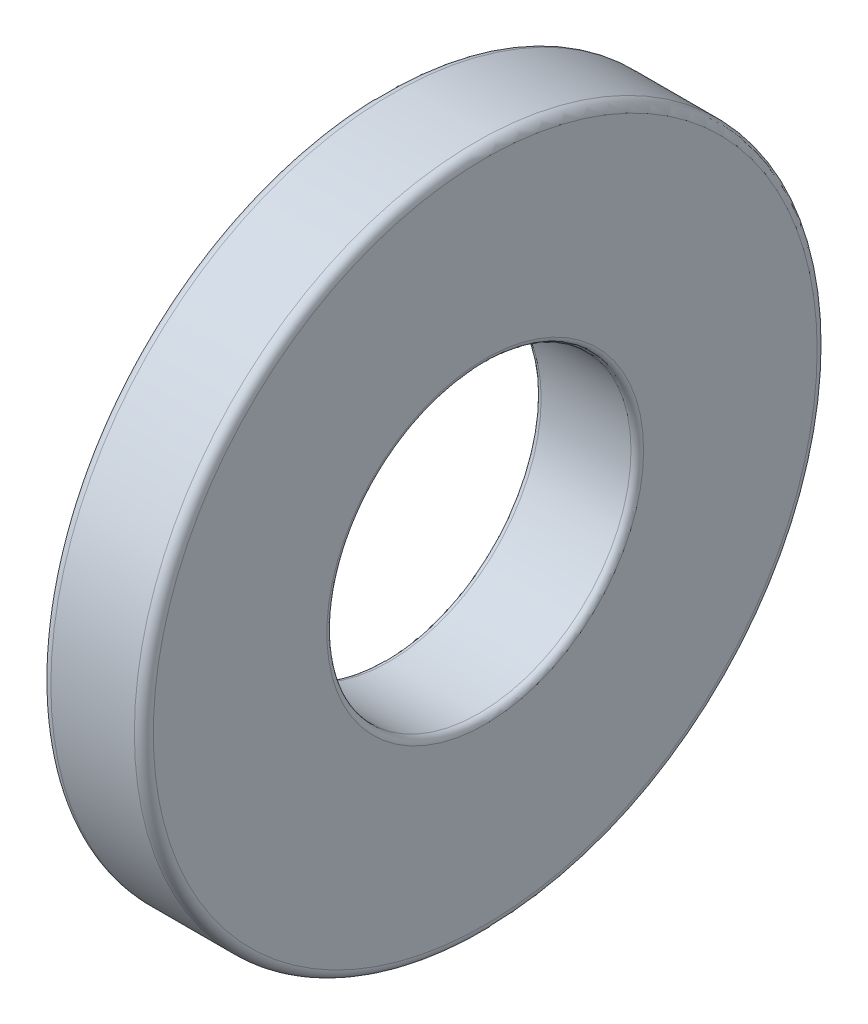
ISO-10303-21;
HEADER;
FILE_DESCRIPTION(('STEP AP214'),'2;1');
FILE_NAME('part.step','',(''),(''),'','','');
FILE_SCHEMA(('AUTOMOTIVE_DESIGN { 1 0 10303 214 1 1 1 1 }'));
ENDSEC;
DATA;
#1=APPLICATION_CONTEXT('core data for automotive mechanical design processes');
#2=APPLICATION_PROTOCOL_DEFINITION('international standard','automotive_design',2000,#1);
#3=PRODUCT_CONTEXT('',#1,'mechanical');
#4=PRODUCT('Part','Part','',(#3));
#5=PRODUCT_RELATED_PRODUCT_CATEGORY('part','',(#4));
#6=PRODUCT_DEFINITION_FORMATION('','',#4);
#7=PRODUCT_DEFINITION_CONTEXT('part definition',#1,'design');
#8=PRODUCT_DEFINITION('design','',#6,#7);
#9=PRODUCT_DEFINITION_SHAPE('','',#8);
#10=(LENGTH_UNIT() NAMED_UNIT(*) SI_UNIT(.MILLI.,.METRE.));
#11=(NAMED_UNIT(*) PLANE_ANGLE_UNIT() SI_UNIT($,.RADIAN.));
#12=(NAMED_UNIT(*) SI_UNIT($,.STERADIAN.) SOLID_ANGLE_UNIT());
#13=UNCERTAINTY_MEASURE_WITH_UNIT(LENGTH_MEASURE(1.E-05),#10,'distance_accuracy_value','');
#14=(GEOMETRIC_REPRESENTATION_CONTEXT(3) GLOBAL_UNCERTAINTY_ASSIGNED_CONTEXT((#13)) GLOBAL_UNIT_ASSIGNED_CONTEXT((#10,
#11,#12)) REPRESENTATION_CONTEXT('',''));
#15=CARTESIAN_POINT('',(0.,0.,0.));
#16=DIRECTION('',(0.,0.,1.));
#17=DIRECTION('',(1.,0.,0.));
#18=AXIS2_PLACEMENT_3D('',#15,#16,#17);
#19=CARTESIAN_POINT('',(1.65,0.,0.));
#20=DIRECTION('',(1.,0.,0.));
#21=DIRECTION('',(0.,0.,-1.));
#22=AXIS2_PLACEMENT_3D('',#19,#20,#21);
#23=PLANE('',#22);
#24=CARTESIAN_POINT('',(1.65,0.,0.));
#25=DIRECTION('',(1.,0.,0.));
#26=DIRECTION('',(0.,0.,-1.));
#27=AXIS2_PLACEMENT_3D('',#24,#25,#26);
#28=CIRCLE('',#27,2.5516);
#29=CARTESIAN_POINT('',(1.65,0.,-2.5516));
#30=VERTEX_POINT('',#29);
#31=EDGE_CURVE('E10',#30,#30,#28,.F.);
#32=ORIENTED_EDGE('',*,*,#31,.T.);
#33=EDGE_LOOP('',(#32));
#34=FACE_BOUND('',#33,.T.);
#35=CARTESIAN_POINT('',(1.65,0.,0.));
#36=DIRECTION('',(1.,0.,0.));
#37=DIRECTION('',(0.,0.,-1.));
#38=AXIS2_PLACEMENT_3D('',#35,#36,#37);
#39=CIRCLE('',#38,5.3476);
#40=CARTESIAN_POINT('',(1.65,0.,-5.3476));
#41=VERTEX_POINT('',#40);
#42=EDGE_CURVE('E51',#41,#41,#39,.T.);
#43=ORIENTED_EDGE('',*,*,#42,.T.);
#44=EDGE_LOOP('',(#43));
#45=FACE_BOUND('',#44,.T.);
#46=ADVANCED_FACE('F31',(#34,#45),#23,.T.);
#47=CARTESIAN_POINT('',(0.,0.,0.));
#48=DIRECTION('',(1.,0.,0.));
#49=DIRECTION('',(0.,0.,-1.));
#50=AXIS2_PLACEMENT_3D('',#47,#48,#49);
#51=PLANE('',#50);
#52=CARTESIAN_POINT('',(0.,0.,0.));
#53=DIRECTION('',(1.,0.,0.));
#54=DIRECTION('',(0.,0.,-1.));
#55=AXIS2_PLACEMENT_3D('',#52,#53,#54);
#56=CIRCLE('',#55,2.5516);
#57=CARTESIAN_POINT('',(0.,0.,-2.5516));
#58=VERTEX_POINT('',#57);
#59=EDGE_CURVE('E46',#58,#58,#56,.T.);
#60=ORIENTED_EDGE('',*,*,#59,.T.);
#61=EDGE_LOOP('',(#60));
#62=FACE_BOUND('',#61,.T.);
#63=CARTESIAN_POINT('',(0.,0.,0.));
#64=DIRECTION('',(1.,0.,0.));
#65=DIRECTION('',(0.,0.,-1.));
#66=AXIS2_PLACEMENT_3D('',#63,#64,#65);
#67=CIRCLE('',#66,5.3476);
#68=CARTESIAN_POINT('',(0.,0.,-5.3476));
#69=VERTEX_POINT('',#68);
#70=EDGE_CURVE('E54',#69,#69,#67,.F.);
#71=ORIENTED_EDGE('',*,*,#70,.T.);
#72=EDGE_LOOP('',(#71));
#73=FACE_BOUND('',#72,.T.);
#74=ADVANCED_FACE('F75',(#62,#73),#51,.F.);
#75=CARTESIAN_POINT('',(1.65,0.,0.));
#76=DIRECTION('',(-1.,0.,0.));
#77=DIRECTION('',(0.,0.,1.));
#78=AXIS2_PLACEMENT_3D('',#75,#76,#77);
#79=CYLINDRICAL_SURFACE('',#78,5.5);
#80=CARTESIAN_POINT('',(0.1524,0.,0.));
#81=DIRECTION('',(1.,0.,0.));
#82=DIRECTION('',(0.,0.,-1.));
#83=AXIS2_PLACEMENT_3D('',#80,#81,#82);
#84=CIRCLE('',#83,5.5);
#85=CARTESIAN_POINT('',(0.1524,0.,-5.5));
#86=VERTEX_POINT('',#85);
#87=EDGE_CURVE('E57',#86,#86,#84,.T.);
#88=ORIENTED_EDGE('',*,*,#87,.T.);
#89=EDGE_LOOP('',(#88));
#90=FACE_BOUND('',#89,.T.);
#91=CARTESIAN_POINT('',(1.4976,0.,0.));
#92=DIRECTION('',(1.,0.,0.));
#93=DIRECTION('',(0.,0.,-1.));
#94=AXIS2_PLACEMENT_3D('',#91,#92,#93);
#95=CIRCLE('',#94,5.5);
#96=CARTESIAN_POINT('',(1.4976,0.,-5.5));
#97=VERTEX_POINT('',#96);
#98=EDGE_CURVE('E60',#97,#97,#95,.F.);
#99=ORIENTED_EDGE('',*,*,#98,.T.);
#100=EDGE_LOOP('',(#99));
#101=FACE_BOUND('',#100,.T.);
#102=ADVANCED_FACE('F64',(#90,#101),#79,.T.);
#103=CARTESIAN_POINT('',(1.65,0.,0.));
#104=DIRECTION('',(-1.,0.,0.));
#105=DIRECTION('',(0.,0.,1.));
#106=AXIS2_PLACEMENT_3D('',#103,#104,#105);
#107=CYLINDRICAL_SURFACE('',#106,2.45);
#108=CARTESIAN_POINT('',(0.1016,0.,0.));
#109=DIRECTION('',(1.,0.,0.));
#110=DIRECTION('',(0.,0.,-1.));
#111=AXIS2_PLACEMENT_3D('',#108,#109,#110);
#112=CIRCLE('',#111,2.45);
#113=CARTESIAN_POINT('',(0.1016,0.,-2.45));
#114=VERTEX_POINT('',#113);
#115=EDGE_CURVE('E38',#114,#114,#112,.F.);
#116=ORIENTED_EDGE('',*,*,#115,.T.);
#117=EDGE_LOOP('',(#116));
#118=FACE_BOUND('',#117,.T.);
#119=CARTESIAN_POINT('',(1.5484,0.,0.));
#120=DIRECTION('',(1.,0.,0.));
#121=DIRECTION('',(0.,0.,-1.));
#122=AXIS2_PLACEMENT_3D('',#119,#120,#121);
#123=CIRCLE('',#122,2.45);
#124=CARTESIAN_POINT('',(1.5484,0.,-2.45));
#125=VERTEX_POINT('',#124);
#126=EDGE_CURVE('E42',#125,#125,#123,.T.);
#127=ORIENTED_EDGE('',*,*,#126,.T.);
#128=EDGE_LOOP('',(#127));
#129=FACE_BOUND('',#128,.T.);
#130=ADVANCED_FACE('F83',(#118,#129),#107,.F.);
#131=CARTESIAN_POINT('',(0.1524,0.,0.));
#132=DIRECTION('',(1.,0.,0.));
#133=DIRECTION('',(0.,0.,-1.));
#134=AXIS2_PLACEMENT_3D('',#131,#132,#133);
#135=TOROIDAL_SURFACE('',#134,5.3476,0.1524);
#136=ORIENTED_EDGE('',*,*,#70,.F.);
#137=EDGE_LOOP('',(#136));
#138=FACE_BOUND('',#137,.T.);
#139=ORIENTED_EDGE('',*,*,#87,.F.);
#140=EDGE_LOOP('',(#139));
#141=FACE_BOUND('',#140,.T.);
#142=ADVANCED_FACE('F70',(#138,#141),#135,.T.);
#143=CARTESIAN_POINT('',(1.4976,0.,0.));
#144=DIRECTION('',(1.,0.,0.));
#145=DIRECTION('',(0.,0.,-1.));
#146=AXIS2_PLACEMENT_3D('',#143,#144,#145);
#147=TOROIDAL_SURFACE('',#146,5.3476,0.1524);
#148=ORIENTED_EDGE('',*,*,#98,.F.);
#149=EDGE_LOOP('',(#148));
#150=FACE_BOUND('',#149,.T.);
#151=ORIENTED_EDGE('',*,*,#42,.F.);
#152=EDGE_LOOP('',(#151));
#153=FACE_BOUND('',#152,.T.);
#154=ADVANCED_FACE('F66',(#150,#153),#147,.T.);
#155=CARTESIAN_POINT('',(0.1016,0.,0.));
#156=DIRECTION('',(1.,0.,0.));
#157=DIRECTION('',(0.,0.,-1.));
#158=AXIS2_PLACEMENT_3D('',#155,#156,#157);
#159=TOROIDAL_SURFACE('',#158,2.5516,0.1016);
#160=ORIENTED_EDGE('',*,*,#115,.F.);
#161=EDGE_LOOP('',(#160));
#162=FACE_BOUND('',#161,.T.);
#163=ORIENTED_EDGE('',*,*,#59,.F.);
#164=EDGE_LOOP('',(#163));
#165=FACE_BOUND('',#164,.T.);
#166=ADVANCED_FACE('F69',(#162,#165),#159,.T.);
#167=CARTESIAN_POINT('',(1.5484,0.,0.));
#168=DIRECTION('',(1.,0.,0.));
#169=DIRECTION('',(0.,0.,-1.));
#170=AXIS2_PLACEMENT_3D('',#167,#168,#169);
#171=TOROIDAL_SURFACE('',#170,2.5516,0.1016);
#172=ORIENTED_EDGE('',*,*,#31,.F.);
#173=EDGE_LOOP('',(#172));
#174=FACE_BOUND('',#173,.T.);
#175=ORIENTED_EDGE('',*,*,#126,.F.);
#176=EDGE_LOOP('',(#175));
#177=FACE_BOUND('',#176,.T.);
#178=ADVANCED_FACE('F33',(#174,#177),#171,.T.);
#179=CLOSED_SHELL('',(#46,#74,#102,#130,#142,#154,#166,#178));
#180=MANIFOLD_SOLID_BREP('B2',#179);
#181=ADVANCED_BREP_SHAPE_REPRESENTATION('',(#18,#180),#14);
#182=SHAPE_DEFINITION_REPRESENTATION(#9,#181);
ENDSEC;
END-ISO-10303-21;
